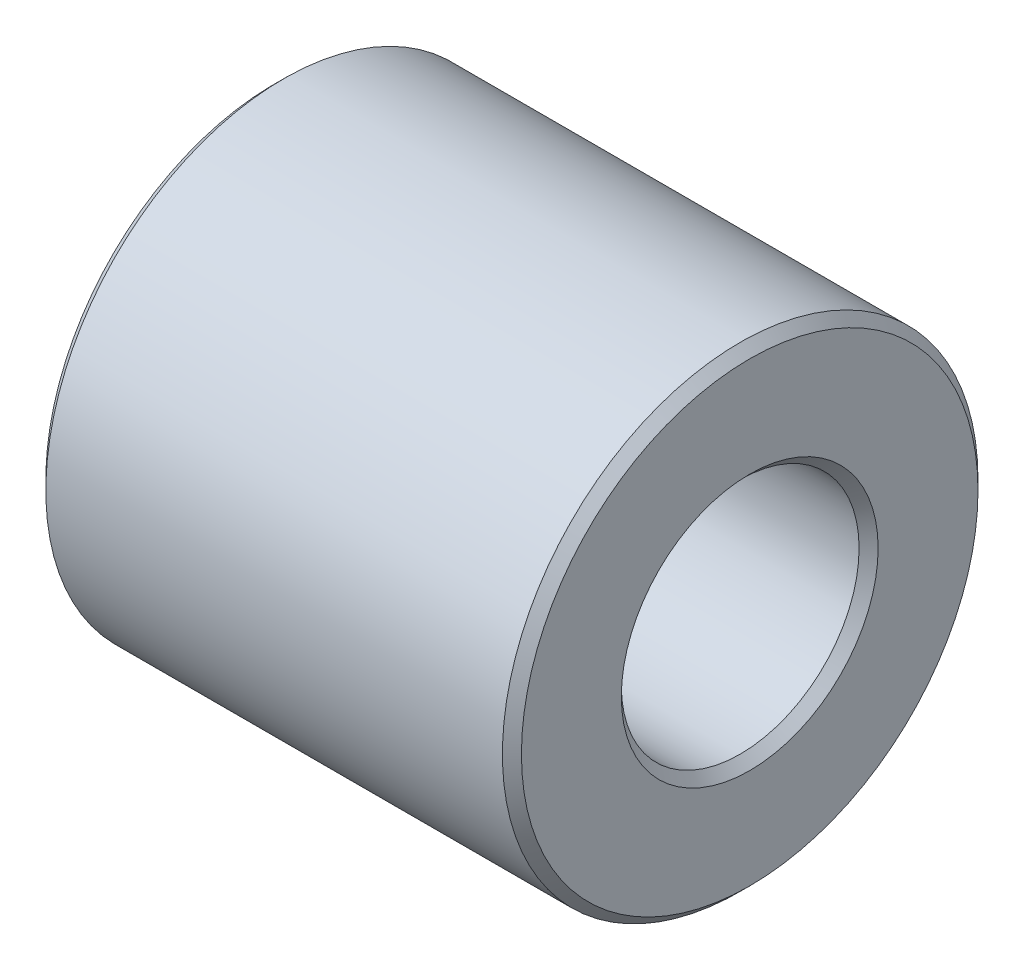
ISO-10303-21;
HEADER;
FILE_DESCRIPTION(('STEP AP214'),'2;1');
FILE_NAME('part.step','',(''),(''),'','','');
FILE_SCHEMA(('AUTOMOTIVE_DESIGN { 1 0 10303 214 1 1 1 1 }'));
ENDSEC;
DATA;
#1=APPLICATION_CONTEXT('core data for automotive mechanical design processes');
#2=APPLICATION_PROTOCOL_DEFINITION('international standard','automotive_design',2000,#1);
#3=PRODUCT_CONTEXT('',#1,'mechanical');
#4=PRODUCT('Part','Part','',(#3));
#5=PRODUCT_RELATED_PRODUCT_CATEGORY('part','',(#4));
#6=PRODUCT_DEFINITION_FORMATION('','',#4);
#7=PRODUCT_DEFINITION_CONTEXT('part definition',#1,'design');
#8=PRODUCT_DEFINITION('design','',#6,#7);
#9=PRODUCT_DEFINITION_SHAPE('','',#8);
#10=(LENGTH_UNIT() NAMED_UNIT(*) SI_UNIT(.MILLI.,.METRE.));
#11=(NAMED_UNIT(*) PLANE_ANGLE_UNIT() SI_UNIT($,.RADIAN.));
#12=(NAMED_UNIT(*) SI_UNIT($,.STERADIAN.) SOLID_ANGLE_UNIT());
#13=UNCERTAINTY_MEASURE_WITH_UNIT(LENGTH_MEASURE(1.E-05),#10,'distance_accuracy_value','');
#14=(GEOMETRIC_REPRESENTATION_CONTEXT(3) GLOBAL_UNCERTAINTY_ASSIGNED_CONTEXT((#13)) GLOBAL_UNIT_ASSIGNED_CONTEXT((#10,
#11,#12)) REPRESENTATION_CONTEXT('',''));
#15=CARTESIAN_POINT('',(0.,0.,0.));
#16=DIRECTION('',(0.,0.,1.));
#17=DIRECTION('',(1.,0.,0.));
#18=AXIS2_PLACEMENT_3D('',#15,#16,#17);
#19=CARTESIAN_POINT('',(0.,-4.79999976765211,4.80000036814291));
#20=DIRECTION('',(-1.,0.,0.));
#21=DIRECTION('',(0.,1.,0.));
#22=AXIS2_PLACEMENT_3D('',#19,#20,#21);
#23=PLANE('',#22);
#24=CARTESIAN_POINT('',(0.,0.,0.));
#25=DIRECTION('',(-1.,0.,0.));
#26=DIRECTION('',(0.,0.,-1.));
#27=AXIS2_PLACEMENT_3D('',#24,#25,#26);
#28=CIRCLE('',#27,4.8);
#29=CARTESIAN_POINT('',(0.,0.,-4.8));
#30=VERTEX_POINT('',#29);
#31=EDGE_CURVE('E44',#30,#30,#28,.F.);
#32=ORIENTED_EDGE('',*,*,#31,.F.);
#33=EDGE_LOOP('',(#32));
#34=FACE_BOUND('',#33,.T.);
#35=CARTESIAN_POINT('',(0.,0.,0.));
#36=DIRECTION('',(1.,0.,0.));
#37=DIRECTION('',(0.,0.,1.));
#38=AXIS2_PLACEMENT_3D('',#35,#36,#37);
#39=CIRCLE('',#38,2.7);
#40=CARTESIAN_POINT('',(0.,0.,2.7));
#41=VERTEX_POINT('',#40);
#42=EDGE_CURVE('E41',#41,#41,#39,.T.);
#43=ORIENTED_EDGE('',*,*,#42,.T.);
#44=EDGE_LOOP('',(#43));
#45=FACE_BOUND('',#44,.T.);
#46=ADVANCED_FACE('F15',(#34,#45),#23,.T.);
#47=CARTESIAN_POINT('',(10.,-4.79999976796793,-4.80000000000001));
#48=DIRECTION('',(1.,0.,0.));
#49=DIRECTION('',(0.,1.,0.));
#50=AXIS2_PLACEMENT_3D('',#47,#48,#49);
#51=PLANE('',#50);
#52=CARTESIAN_POINT('',(10.,0.,0.));
#53=DIRECTION('',(1.,0.,0.));
#54=DIRECTION('',(0.,-1.41721915684439E-07,0.99999999999999));
#55=AXIS2_PLACEMENT_3D('',#52,#53,#54);
#56=CIRCLE('',#55,4.8);
#57=CARTESIAN_POINT('',(10.,-6.80265195285306E-07,4.79999999999995));
#58=VERTEX_POINT('',#57);
#59=EDGE_CURVE('E38',#58,#58,#56,.T.);
#60=ORIENTED_EDGE('',*,*,#59,.T.);
#61=EDGE_LOOP('',(#60));
#62=FACE_BOUND('',#61,.T.);
#63=CARTESIAN_POINT('',(10.,0.,0.));
#64=DIRECTION('',(-1.,0.,0.));
#65=DIRECTION('',(0.,0.,-1.));
#66=AXIS2_PLACEMENT_3D('',#63,#64,#65);
#67=CIRCLE('',#66,2.7);
#68=CARTESIAN_POINT('',(10.,0.,-2.7));
#69=VERTEX_POINT('',#68);
#70=EDGE_CURVE('E35',#69,#69,#67,.F.);
#71=ORIENTED_EDGE('',*,*,#70,.F.);
#72=EDGE_LOOP('',(#71));
#73=FACE_BOUND('',#72,.T.);
#74=ADVANCED_FACE('F52',(#62,#73),#51,.T.);
#75=CARTESIAN_POINT('',(0.200000000000001,0.,0.));
#76=DIRECTION('',(1.,0.,0.));
#77=DIRECTION('',(0.,1.92343152856519E-10,1.));
#78=AXIS2_PLACEMENT_3D('',#75,#76,#77);
#79=CONICAL_SURFACE('',#78,5.,0.785398163397449);
#80=CARTESIAN_POINT('',(0.200000000000001,0.,0.));
#81=DIRECTION('',(-1.,0.,0.));
#82=DIRECTION('',(0.,0.,-1.));
#83=AXIS2_PLACEMENT_3D('',#80,#81,#82);
#84=CIRCLE('',#83,5.);
#85=CARTESIAN_POINT('',(0.200000000000001,0.,-5.));
#86=VERTEX_POINT('',#85);
#87=EDGE_CURVE('E30',#86,#86,#84,.F.);
#88=ORIENTED_EDGE('',*,*,#87,.F.);
#89=EDGE_LOOP('',(#88));
#90=FACE_BOUND('',#89,.T.);
#91=ORIENTED_EDGE('',*,*,#31,.T.);
#92=EDGE_LOOP('',(#91));
#93=FACE_BOUND('',#92,.T.);
#94=ADVANCED_FACE('F48',(#90,#93),#79,.T.);
#95=CARTESIAN_POINT('',(10.,0.,0.));
#96=DIRECTION('',(1.,0.,0.));
#97=DIRECTION('',(0.,7.69370911764408E-10,1.));
#98=AXIS2_PLACEMENT_3D('',#95,#96,#97);
#99=CYLINDRICAL_SURFACE('',#98,5.);
#100=CARTESIAN_POINT('',(9.8,0.,0.));
#101=DIRECTION('',(-1.,0.,0.));
#102=DIRECTION('',(0.,0.,-1.));
#103=AXIS2_PLACEMENT_3D('',#100,#101,#102);
#104=CIRCLE('',#103,5.);
#105=CARTESIAN_POINT('',(9.8,0.,-5.));
#106=VERTEX_POINT('',#105);
#107=EDGE_CURVE('E26',#106,#106,#104,.F.);
#108=ORIENTED_EDGE('',*,*,#107,.F.);
#109=EDGE_LOOP('',(#108));
#110=FACE_BOUND('',#109,.T.);
#111=ORIENTED_EDGE('',*,*,#87,.T.);
#112=EDGE_LOOP('',(#111));
#113=FACE_BOUND('',#112,.T.);
#114=ADVANCED_FACE('F66',(#110,#113),#99,.T.);
#115=CARTESIAN_POINT('',(9.8,0.,0.));
#116=DIRECTION('',(-1.,0.,0.));
#117=DIRECTION('',(0.,0.,-1.));
#118=AXIS2_PLACEMENT_3D('',#115,#116,#117);
#119=CONICAL_SURFACE('',#118,5.,0.785398163397453);
#120=ORIENTED_EDGE('',*,*,#59,.F.);
#121=EDGE_LOOP('',(#120));
#122=FACE_BOUND('',#121,.T.);
#123=ORIENTED_EDGE('',*,*,#107,.T.);
#124=EDGE_LOOP('',(#123));
#125=FACE_BOUND('',#124,.T.);
#126=ADVANCED_FACE('F59',(#122,#125),#119,.T.);
#127=CARTESIAN_POINT('',(0.,0.,0.));
#128=DIRECTION('',(-1.,0.,0.));
#129=DIRECTION('',(0.,0.,-1.));
#130=AXIS2_PLACEMENT_3D('',#127,#128,#129);
#131=CONICAL_SURFACE('',#130,2.7,0.785398163397446);
#132=ORIENTED_EDGE('',*,*,#42,.F.);
#133=EDGE_LOOP('',(#132));
#134=FACE_BOUND('',#133,.T.);
#135=CARTESIAN_POINT('',(0.2,0.,0.));
#136=DIRECTION('',(1.,0.,0.));
#137=DIRECTION('',(0.,0.,1.));
#138=AXIS2_PLACEMENT_3D('',#135,#136,#137);
#139=CIRCLE('',#138,2.5);
#140=CARTESIAN_POINT('',(0.2,0.,2.5));
#141=VERTEX_POINT('',#140);
#142=EDGE_CURVE('E22',#141,#141,#139,.T.);
#143=ORIENTED_EDGE('',*,*,#142,.T.);
#144=EDGE_LOOP('',(#143));
#145=FACE_BOUND('',#144,.T.);
#146=ADVANCED_FACE('F56',(#134,#145),#131,.F.);
#147=CARTESIAN_POINT('',(10.,0.,0.));
#148=DIRECTION('',(1.,0.,0.));
#149=DIRECTION('',(0.,7.6930563065056E-10,1.));
#150=AXIS2_PLACEMENT_3D('',#147,#148,#149);
#151=CYLINDRICAL_SURFACE('',#150,2.5);
#152=CARTESIAN_POINT('',(9.8,0.,0.));
#153=DIRECTION('',(1.,0.,0.));
#154=DIRECTION('',(0.,0.,1.));
#155=AXIS2_PLACEMENT_3D('',#152,#153,#154);
#156=CIRCLE('',#155,2.5);
#157=CARTESIAN_POINT('',(9.8,0.,2.5));
#158=VERTEX_POINT('',#157);
#159=EDGE_CURVE('E10',#158,#158,#156,.T.);
#160=ORIENTED_EDGE('',*,*,#159,.T.);
#161=EDGE_LOOP('',(#160));
#162=FACE_BOUND('',#161,.T.);
#163=ORIENTED_EDGE('',*,*,#142,.F.);
#164=EDGE_LOOP('',(#163));
#165=FACE_BOUND('',#164,.T.);
#166=ADVANCED_FACE('F58',(#162,#165),#151,.F.);
#167=CARTESIAN_POINT('',(10.,0.,0.));
#168=DIRECTION('',(1.,0.,0.));
#169=DIRECTION('',(0.,0.,1.));
#170=AXIS2_PLACEMENT_3D('',#167,#168,#169);
#171=CONICAL_SURFACE('',#170,2.7,0.785398163397452);
#172=ORIENTED_EDGE('',*,*,#70,.T.);
#173=EDGE_LOOP('',(#172));
#174=FACE_BOUND('',#173,.T.);
#175=ORIENTED_EDGE('',*,*,#159,.F.);
#176=EDGE_LOOP('',(#175));
#177=FACE_BOUND('',#176,.T.);
#178=ADVANCED_FACE('F17',(#174,#177),#171,.F.);
#179=CLOSED_SHELL('',(#46,#74,#94,#114,#126,#146,#166,#178));
#180=MANIFOLD_SOLID_BREP('B1',#179);
#181=ADVANCED_BREP_SHAPE_REPRESENTATION('',(#18,#180),#14);
#182=SHAPE_DEFINITION_REPRESENTATION(#9,#181);
ENDSEC;
END-ISO-10303-21;
